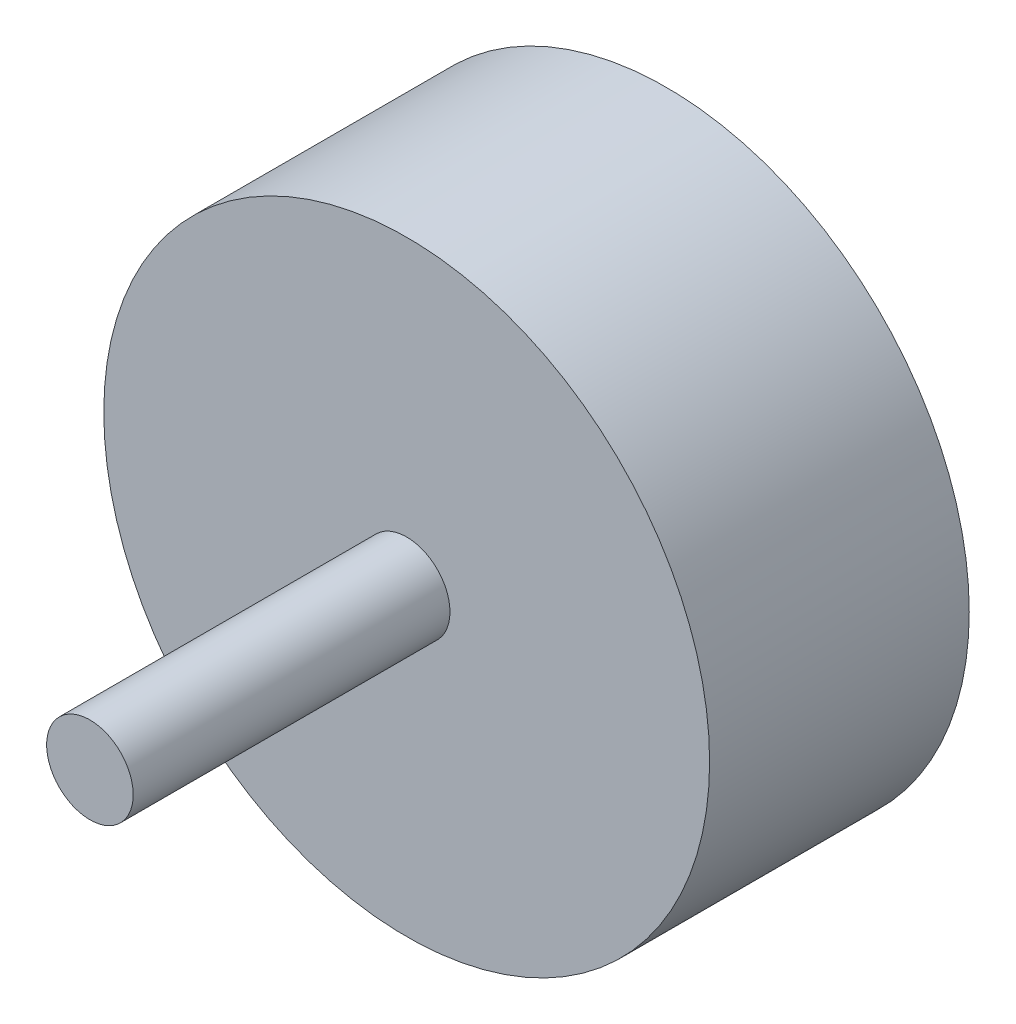
ISO-10303-21;
HEADER;
FILE_DESCRIPTION(('STEP AP214'),'2;1');
FILE_NAME('part.step','',(''),(''),'','','');
FILE_SCHEMA(('AUTOMOTIVE_DESIGN { 1 0 10303 214 1 1 1 1 }'));
ENDSEC;
DATA;
#1=APPLICATION_CONTEXT('core data for automotive mechanical design processes');
#2=APPLICATION_PROTOCOL_DEFINITION('international standard','automotive_design',2000,#1);
#3=PRODUCT_CONTEXT('',#1,'mechanical');
#4=PRODUCT('Part','Part','',(#3));
#5=PRODUCT_RELATED_PRODUCT_CATEGORY('part','',(#4));
#6=PRODUCT_DEFINITION_FORMATION('','',#4);
#7=PRODUCT_DEFINITION_CONTEXT('part definition',#1,'design');
#8=PRODUCT_DEFINITION('design','',#6,#7);
#9=PRODUCT_DEFINITION_SHAPE('','',#8);
#10=(LENGTH_UNIT() NAMED_UNIT(*) SI_UNIT(.MILLI.,.METRE.));
#11=(NAMED_UNIT(*) PLANE_ANGLE_UNIT() SI_UNIT($,.RADIAN.));
#12=(NAMED_UNIT(*) SI_UNIT($,.STERADIAN.) SOLID_ANGLE_UNIT());
#13=UNCERTAINTY_MEASURE_WITH_UNIT(LENGTH_MEASURE(1.E-05),#10,'distance_accuracy_value','');
#14=(GEOMETRIC_REPRESENTATION_CONTEXT(3) GLOBAL_UNCERTAINTY_ASSIGNED_CONTEXT((#13)) GLOBAL_UNIT_ASSIGNED_CONTEXT((#10,
#11,#12)) REPRESENTATION_CONTEXT('',''));
#15=CARTESIAN_POINT('',(0.,0.,0.));
#16=DIRECTION('',(0.,0.,1.));
#17=DIRECTION('',(1.,0.,0.));
#18=AXIS2_PLACEMENT_3D('',#15,#16,#17);
#19=CARTESIAN_POINT('',(0.,0.,76.2));
#20=DIRECTION('',(0.,0.,-1.));
#21=DIRECTION('',(-1.,0.,0.));
#22=AXIS2_PLACEMENT_3D('',#19,#20,#21);
#23=CYLINDRICAL_SURFACE('',#22,88.9);
#24=CARTESIAN_POINT('',(0.,0.,76.2));
#25=DIRECTION('',(0.,0.,1.));
#26=DIRECTION('',(1.,0.,0.));
#27=AXIS2_PLACEMENT_3D('',#24,#25,#26);
#28=CIRCLE('',#27,88.9);
#29=CARTESIAN_POINT('',(-88.9,0.,76.2));
#30=VERTEX_POINT('',#29);
#31=EDGE_CURVE('E10',#30,#30,#28,.T.);
#32=CARTESIAN_POINT('',(0.,0.,0.));
#33=DIRECTION('',(0.,0.,1.));
#34=DIRECTION('',(1.,0.,0.));
#35=AXIS2_PLACEMENT_3D('',#32,#33,#34);
#36=CIRCLE('',#35,88.9);
#37=CARTESIAN_POINT('',(-88.9,0.,0.));
#38=VERTEX_POINT('',#37);
#39=EDGE_CURVE('E37',#38,#38,#36,.T.);
#40=CARTESIAN_POINT('',(-88.9,0.,76.2));
#41=CARTESIAN_POINT('',(-88.9,0.,75.40625));
#42=CARTESIAN_POINT('',(-88.9,0.,74.6125));
#43=CARTESIAN_POINT('',(-88.9,0.,73.025));
#44=CARTESIAN_POINT('',(-88.9,0.,72.23125));
#45=CARTESIAN_POINT('',(-88.9,0.,70.64375));
#46=CARTESIAN_POINT('',(-88.9,0.,69.85));
#47=CARTESIAN_POINT('',(-88.9,0.,68.2625));
#48=CARTESIAN_POINT('',(-88.9,0.,67.46875));
#49=CARTESIAN_POINT('',(-88.9,0.,65.88125));
#50=CARTESIAN_POINT('',(-88.9,0.,65.0875));
#51=CARTESIAN_POINT('',(-88.9,0.,63.5));
#52=CARTESIAN_POINT('',(-88.9,0.,62.70625));
#53=CARTESIAN_POINT('',(-88.9,0.,61.11875));
#54=CARTESIAN_POINT('',(-88.9,0.,60.325));
#55=CARTESIAN_POINT('',(-88.9,0.,58.7375));
#56=CARTESIAN_POINT('',(-88.9,0.,57.94375));
#57=CARTESIAN_POINT('',(-88.9,0.,56.35625));
#58=CARTESIAN_POINT('',(-88.9,0.,55.5625));
#59=CARTESIAN_POINT('',(-88.9,0.,53.975));
#60=CARTESIAN_POINT('',(-88.9,0.,53.18125));
#61=CARTESIAN_POINT('',(-88.9,0.,51.59375));
#62=CARTESIAN_POINT('',(-88.9,0.,50.8));
#63=CARTESIAN_POINT('',(-88.9,0.,49.2125));
#64=CARTESIAN_POINT('',(-88.9,0.,48.41875));
#65=CARTESIAN_POINT('',(-88.9,0.,46.83125));
#66=CARTESIAN_POINT('',(-88.9,0.,46.0375));
#67=CARTESIAN_POINT('',(-88.9,0.,44.45));
#68=CARTESIAN_POINT('',(-88.9,0.,43.65625));
#69=CARTESIAN_POINT('',(-88.9,0.,42.06875));
#70=CARTESIAN_POINT('',(-88.9,0.,41.275));
#71=CARTESIAN_POINT('',(-88.9,0.,39.6875));
#72=CARTESIAN_POINT('',(-88.9,0.,38.89375));
#73=CARTESIAN_POINT('',(-88.9,0.,37.30625));
#74=CARTESIAN_POINT('',(-88.9,0.,36.5125));
#75=CARTESIAN_POINT('',(-88.9,0.,34.925));
#76=CARTESIAN_POINT('',(-88.9,0.,34.13125));
#77=CARTESIAN_POINT('',(-88.9,0.,32.54375));
#78=CARTESIAN_POINT('',(-88.9,0.,31.75));
#79=CARTESIAN_POINT('',(-88.9,0.,30.1625));
#80=CARTESIAN_POINT('',(-88.9,0.,29.36875));
#81=CARTESIAN_POINT('',(-88.9,0.,27.78125));
#82=CARTESIAN_POINT('',(-88.9,0.,26.9875));
#83=CARTESIAN_POINT('',(-88.9,0.,25.4));
#84=CARTESIAN_POINT('',(-88.9,0.,24.60625));
#85=CARTESIAN_POINT('',(-88.9,0.,23.01875));
#86=CARTESIAN_POINT('',(-88.9,0.,22.225));
#87=CARTESIAN_POINT('',(-88.9,0.,20.6375));
#88=CARTESIAN_POINT('',(-88.9,0.,19.84375));
#89=CARTESIAN_POINT('',(-88.9,0.,18.25625));
#90=CARTESIAN_POINT('',(-88.9,0.,17.4625));
#91=CARTESIAN_POINT('',(-88.9,0.,15.875));
#92=CARTESIAN_POINT('',(-88.9,0.,15.08125));
#93=CARTESIAN_POINT('',(-88.9,0.,13.49375));
#94=CARTESIAN_POINT('',(-88.9,0.,12.7));
#95=CARTESIAN_POINT('',(-88.9,0.,11.1125));
#96=CARTESIAN_POINT('',(-88.9,0.,10.31875));
#97=CARTESIAN_POINT('',(-88.9,0.,8.73125));
#98=CARTESIAN_POINT('',(-88.9,0.,7.93750000000001));
#99=CARTESIAN_POINT('',(-88.9,0.,6.35));
#100=CARTESIAN_POINT('',(-88.9,0.,5.55625));
#101=CARTESIAN_POINT('',(-88.9,0.,3.96875));
#102=CARTESIAN_POINT('',(-88.9,0.,3.175));
#103=CARTESIAN_POINT('',(-88.9,0.,1.5875));
#104=CARTESIAN_POINT('',(-88.9,0.,0.793750000000001));
#105=CARTESIAN_POINT('',(-88.9,0.,0.));
#106=B_SPLINE_CURVE_WITH_KNOTS('',3,(#40,#41,#42,#43,#44,#45,#46,#47,#48,#49,#50,#51,#52,#53,
#54,#55,#56,#57,#58,#59,#60,#61,#62,#63,#64,#65,#66,#67,#68,#69,#70,#71,#72,#73,#74,#75,#76,#77,
#78,#79,#80,#81,#82,#83,#84,#85,#86,#87,#88,#89,#90,#91,#92,#93,#94,#95,#96,#97,#98,#99,#100,
#101,#102,#103,#104,#105),.UNSPECIFIED.,.F.,.F.,(4,2,2,2,2,2,2,2,2,2,2,2,2,2,2,2,2,2,2,2,2,2,2,
2,2,2,2,2,2,2,2,2,4),(0.,2.38124999999999,4.76249999999999,7.14374999999999,9.52499999999999,
11.90625,14.2875,16.66875,19.05,21.43125,23.8125,26.19375,28.575,30.95625,33.3375,35.71875,38.1,
40.48125,42.8625,45.24375,47.625,50.00625,52.3875,54.76875,57.15,59.53125,61.9125,64.29375,
66.675,69.05625,71.4375,73.81875,76.2),.UNSPECIFIED.);
#107=EDGE_CURVE('BSEAM34',#30,#38,#106,.T.);
#108=ORIENTED_EDGE('',*,*,#31,.F.);
#109=ORIENTED_EDGE('',*,*,#39,.T.);
#110=ORIENTED_EDGE('',*,*,#107,.T.);
#111=ORIENTED_EDGE('',*,*,#107,.F.);
#112=EDGE_LOOP('',(#108,#110,#109,#111));
#113=FACE_BOUND('',#112,.T.);
#114=ADVANCED_FACE('F34',(#113),#23,.T.);
#115=CARTESIAN_POINT('',(0.,0.,76.2));
#116=DIRECTION('',(0.,0.,1.));
#117=DIRECTION('',(1.,0.,0.));
#118=AXIS2_PLACEMENT_3D('',#115,#116,#117);
#119=PLANE('',#118);
#120=CARTESIAN_POINT('',(0.,0.,76.2));
#121=DIRECTION('',(0.,0.,1.));
#122=DIRECTION('',(1.,0.,0.));
#123=AXIS2_PLACEMENT_3D('',#120,#121,#122);
#124=CIRCLE('',#123,12.7);
#125=CARTESIAN_POINT('',(12.7,0.,76.2));
#126=VERTEX_POINT('',#125);
#127=EDGE_CURVE('E46',#126,#126,#124,.T.);
#128=ORIENTED_EDGE('',*,*,#127,.F.);
#129=EDGE_LOOP('',(#128));
#130=FACE_BOUND('',#129,.T.);
#131=ORIENTED_EDGE('',*,*,#31,.T.);
#132=EDGE_LOOP('',(#131));
#133=FACE_BOUND('',#132,.T.);
#134=ADVANCED_FACE('F61',(#130,#133),#119,.T.);
#135=CARTESIAN_POINT('',(0.,0.,0.));
#136=DIRECTION('',(0.,0.,1.));
#137=DIRECTION('',(1.,0.,0.));
#138=AXIS2_PLACEMENT_3D('',#135,#136,#137);
#139=PLANE('',#138);
#140=ORIENTED_EDGE('',*,*,#39,.F.);
#141=EDGE_LOOP('',(#140));
#142=FACE_BOUND('',#141,.T.);
#143=ADVANCED_FACE('F57',(#142),#139,.F.);
#144=CARTESIAN_POINT('',(0.,0.,169.164));
#145=DIRECTION('',(0.,0.,-1.));
#146=DIRECTION('',(-1.,0.,0.));
#147=AXIS2_PLACEMENT_3D('',#144,#145,#146);
#148=CYLINDRICAL_SURFACE('',#147,12.7);
#149=CARTESIAN_POINT('',(0.,0.,169.164));
#150=DIRECTION('',(0.,0.,1.));
#151=DIRECTION('',(1.,0.,0.));
#152=AXIS2_PLACEMENT_3D('',#149,#150,#151);
#153=CIRCLE('',#152,12.7);
#154=CARTESIAN_POINT('',(12.7,0.,169.164));
#155=VERTEX_POINT('',#154);
#156=EDGE_CURVE('E44',#155,#155,#153,.T.);
#157=ORIENTED_EDGE('',*,*,#156,.F.);
#158=EDGE_LOOP('',(#157));
#159=FACE_BOUND('',#158,.T.);
#160=ORIENTED_EDGE('',*,*,#127,.T.);
#161=EDGE_LOOP('',(#160));
#162=FACE_BOUND('',#161,.T.);
#163=ADVANCED_FACE('F54',(#159,#162),#148,.T.);
#164=CARTESIAN_POINT('',(0.,0.,169.164));
#165=DIRECTION('',(0.,0.,1.));
#166=DIRECTION('',(1.,0.,0.));
#167=AXIS2_PLACEMENT_3D('',#164,#165,#166);
#168=PLANE('',#167);
#169=ORIENTED_EDGE('',*,*,#156,.T.);
#170=EDGE_LOOP('',(#169));
#171=FACE_BOUND('',#170,.T.);
#172=ADVANCED_FACE('F52',(#171),#168,.T.);
#173=CLOSED_SHELL('',(#114,#134,#143,#163,#172));
#174=MANIFOLD_SOLID_BREP('B2',#173);
#175=ADVANCED_BREP_SHAPE_REPRESENTATION('',(#18,#174),#14);
#176=SHAPE_DEFINITION_REPRESENTATION(#9,#175);
ENDSEC;
END-ISO-10303-21;
